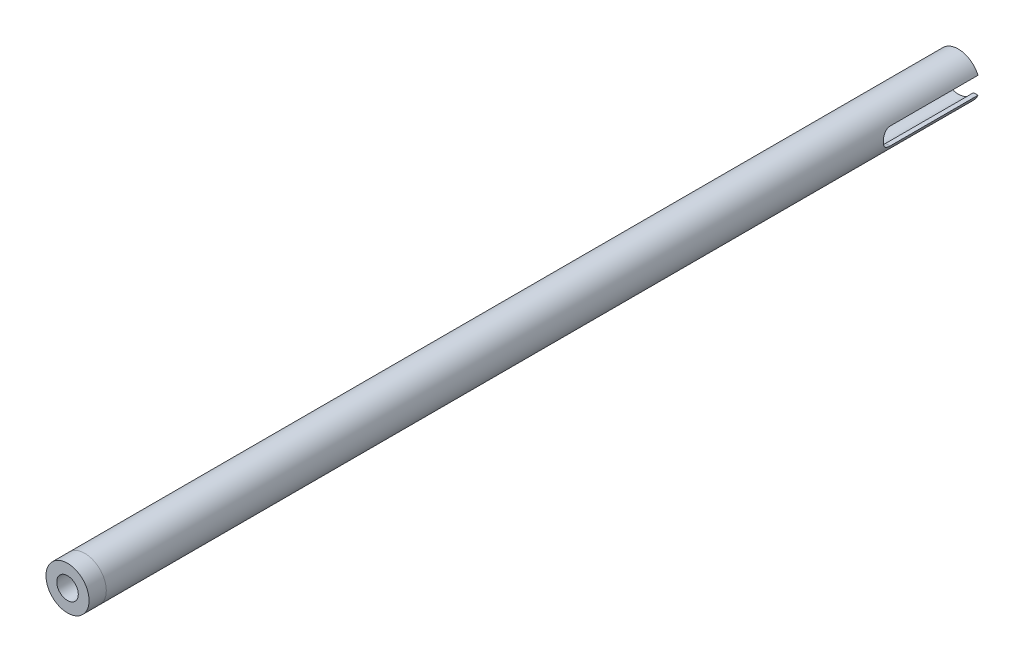
ISO-10303-21;
HEADER;
FILE_DESCRIPTION(('STEP AP214'),'2;1');
FILE_NAME('part.step','',(''),(''),'','','');
FILE_SCHEMA(('AUTOMOTIVE_DESIGN { 1 0 10303 214 1 1 1 1 }'));
ENDSEC;
DATA;
#1=APPLICATION_CONTEXT('core data for automotive mechanical design processes');
#2=APPLICATION_PROTOCOL_DEFINITION('international standard','automotive_design',2000,#1);
#3=PRODUCT_CONTEXT('',#1,'mechanical');
#4=PRODUCT('Part','Part','',(#3));
#5=PRODUCT_RELATED_PRODUCT_CATEGORY('part','',(#4));
#6=PRODUCT_DEFINITION_FORMATION('','',#4);
#7=PRODUCT_DEFINITION_CONTEXT('part definition',#1,'design');
#8=PRODUCT_DEFINITION('design','',#6,#7);
#9=PRODUCT_DEFINITION_SHAPE('','',#8);
#10=(LENGTH_UNIT() NAMED_UNIT(*) SI_UNIT(.MILLI.,.METRE.));
#11=(NAMED_UNIT(*) PLANE_ANGLE_UNIT() SI_UNIT($,.RADIAN.));
#12=(NAMED_UNIT(*) SI_UNIT($,.STERADIAN.) SOLID_ANGLE_UNIT());
#13=UNCERTAINTY_MEASURE_WITH_UNIT(LENGTH_MEASURE(1.E-05),#10,'distance_accuracy_value','');
#14=(GEOMETRIC_REPRESENTATION_CONTEXT(3) GLOBAL_UNCERTAINTY_ASSIGNED_CONTEXT((#13)) GLOBAL_UNIT_ASSIGNED_CONTEXT((#10,
#11,#12)) REPRESENTATION_CONTEXT('',''));
#15=CARTESIAN_POINT('',(0.,0.,0.));
#16=DIRECTION('',(0.,0.,1.));
#17=DIRECTION('',(1.,0.,0.));
#18=AXIS2_PLACEMENT_3D('',#15,#16,#17);
#19=CARTESIAN_POINT('',(0.,0.,-328.070249741066));
#20=DIRECTION('',(0.,0.,1.));
#21=DIRECTION('',(1.,0.,0.));
#22=AXIS2_PLACEMENT_3D('',#19,#20,#21);
#23=CYLINDRICAL_SURFACE('',#22,7.9375);
#24=CARTESIAN_POINT('',(0.,0.,-6.35));
#25=DIRECTION('',(0.,0.,1.));
#26=DIRECTION('',(1.,0.,0.));
#27=AXIS2_PLACEMENT_3D('',#24,#25,#26);
#28=CIRCLE('',#27,7.9375);
#29=CARTESIAN_POINT('',(7.9375,0.,-6.35));
#30=VERTEX_POINT('',#29);
#31=EDGE_CURVE('E167',#30,#30,#28,.T.);
#32=ORIENTED_EDGE('',*,*,#31,.F.);
#33=EDGE_LOOP('',(#32));
#34=FACE_BOUND('',#33,.T.);
#35=CARTESIAN_POINT('',(-7.2748389157424,3.175,-295.685249741066));
#36=CARTESIAN_POINT('',(-7.27482137043434,3.17501267173453,-295.599829625583));
#37=CARTESIAN_POINT('',(-7.27634297592672,3.17155313247793,-295.514419096021));
#38=CARTESIAN_POINT('',(-7.28233338484875,3.15778866907725,-295.344287091693));
#39=CARTESIAN_POINT('',(-7.28680106535325,3.14748635311323,-295.259565366834));
#40=CARTESIAN_POINT('',(-7.2985291631267,3.12019002880163,-295.091751667025));
#41=CARTESIAN_POINT('',(-7.30577831906487,3.10322299732752,-295.008654522266));
#42=CARTESIAN_POINT('',(-7.32282161153744,3.06278779397035,-294.84434342024));
#43=CARTESIAN_POINT('',(-7.33261590324725,3.03931922568674,-294.763129578127));
#44=CARTESIAN_POINT('',(-7.36535331460444,2.95952924342962,-294.523304755544));
#45=CARTESIAN_POINT('',(-7.39167595677839,2.89376893609239,-294.36817982674));
#46=CARTESIAN_POINT('',(-7.45033259991547,2.73920602658923,-294.071092400029));
#47=CARTESIAN_POINT('',(-7.48267254395243,2.65038060922872,-293.929143124811));
#48=CARTESIAN_POINT('',(-7.55175295441387,2.44684429809694,-293.654422355292));
#49=CARTESIAN_POINT('',(-7.58863404630155,2.33103943595687,-293.52249497078));
#50=CARTESIAN_POINT('',(-7.66147718953598,2.07914562663533,-293.279332087148));
#51=CARTESIAN_POINT('',(-7.69743902899202,1.94305205135846,-293.16810132222));
#52=CARTESIAN_POINT('',(-7.76611692840651,1.64778282664419,-292.965180122725));
#53=CARTESIAN_POINT('',(-7.79864638434712,1.48790317306356,-292.874445711321));
#54=CARTESIAN_POINT('',(-7.85502980346525,1.15369615984563,-292.721588157904));
#55=CARTESIAN_POINT('',(-7.87889360585224,0.979385463602722,-292.659432545286));
#56=CARTESIAN_POINT('',(-7.91022225039827,0.670405323433354,-292.57892090163));
#57=CARTESIAN_POINT('',(-7.92038443902171,0.537888188660439,-292.553242978221));
#58=CARTESIAN_POINT('',(-7.93061686811603,0.337231082382107,-292.527487895139));
#59=CARTESIAN_POINT('',(-7.93319257341971,0.269991647180298,-292.521029797859));
#60=CARTESIAN_POINT('',(-7.93663621925193,0.135173873369596,-292.512408780107));
#61=CARTESIAN_POINT('',(-7.93750363389236,0.0675954368175869,-292.510247182288));
#62=CARTESIAN_POINT('',(-7.9375,0.,-292.510249741066));
#63=B_SPLINE_CURVE_WITH_KNOTS('',3,(#35,#36,#37,#38,#39,#40,#41,#42,#43,#44,#45,#46,#47,#48,#49,
#50,#51,#52,#53,#54,#55,#56,#57,#58,#59,#60,#61,#62),.UNSPECIFIED.,.F.,.F.,(4,2,2,2,2,2,2,2,2,2,
2,2,2,4),(0.,0.256160797396612,0.512224013007058,0.767261264672238,1.02231406945471,
1.53142416248594,2.04103978047897,2.57679273649405,3.11266809162683,3.66991136029742,
4.22651992730645,4.63134321412666,4.8339937586662,5.03670667834028),.UNSPECIFIED.);
#64=CARTESIAN_POINT('',(-7.2748389157424,3.175,-295.685249741066));
#65=VERTEX_POINT('',#64);
#66=CARTESIAN_POINT('',(-7.9375,0.,-292.510249741066));
#67=VERTEX_POINT('',#66);
#68=EDGE_CURVE('E194',#65,#67,#63,.T.);
#69=ORIENTED_EDGE('',*,*,#68,.T.);
#70=CARTESIAN_POINT('',(-7.9375,0.,-292.510249741066));
#71=CARTESIAN_POINT('',(-7.93751279435796,-0.0856973243893185,-292.510237710897));
#72=CARTESIAN_POINT('',(-7.93611246860092,-0.171386675169291,-292.513719078369));
#73=CARTESIAN_POINT('',(-7.93058107051394,-0.342092796869088,-292.527575173703));
#74=CARTESIAN_POINT('',(-7.92645080745519,-0.427109759557717,-292.537947858687));
#75=CARTESIAN_POINT('',(-7.91557399086504,-0.595570690948319,-292.565445052754));
#76=CARTESIAN_POINT('',(-7.90883664469869,-0.67901912358001,-292.582545804027));
#77=CARTESIAN_POINT('',(-7.89293284658536,-0.844038966454646,-292.6233130515));
#78=CARTESIAN_POINT('',(-7.88376629739099,-0.925610301410303,-292.646979810557));
#79=CARTESIAN_POINT('',(-7.85297007832481,-1.16656173687588,-292.727487466256));
#80=CARTESIAN_POINT('',(-7.82802544143958,-1.32244720282989,-292.793880099133));
#81=CARTESIAN_POINT('',(-7.77174407779742,-1.62081902572888,-292.949925503126));
#82=CARTESIAN_POINT('',(-7.74040257287306,-1.7632952496653,-293.039595675189));
#83=CARTESIAN_POINT('',(-7.67287736621953,-2.03755465224644,-293.244049282704));
#84=CARTESIAN_POINT('',(-7.63654472176442,-2.16862853615059,-293.359736139436));
#85=CARTESIAN_POINT('',(-7.56380976030912,-2.41011022612819,-293.611030241145));
#86=CARTESIAN_POINT('',(-7.52740741976911,-2.52050895891189,-293.746646185627));
#87=CARTESIAN_POINT('',(-7.45683282624284,-2.72240939900242,-294.041344680493));
#88=CARTESIAN_POINT('',(-7.4228346735038,-2.81283701743189,-294.201208670409));
#89=CARTESIAN_POINT('',(-7.3633362219632,-2.96511894168388,-294.535334635205));
#90=CARTESIAN_POINT('',(-7.33782422493328,-3.02701262758154,-294.709576372964));
#91=CARTESIAN_POINT('',(-7.30424985403508,-3.10695047193342,-295.017880097616));
#92=CARTESIAN_POINT('',(-7.29331360019113,-3.13238569878909,-295.149738858502));
#93=CARTESIAN_POINT('',(-7.28227977674291,-3.15790858319001,-295.349455740196));
#94=CARTESIAN_POINT('',(-7.27949685702346,-3.16431127275807,-295.416404030955));
#95=CARTESIAN_POINT('',(-7.27577355567174,-3.17285909036155,-295.550645588822));
#96=CARTESIAN_POINT('',(-7.27483380475762,-3.1750027609968,-295.617938966119));
#97=CARTESIAN_POINT('',(-7.2748389157424,-3.175,-295.685249741066));
#98=B_SPLINE_CURVE_WITH_KNOTS('',3,(#70,#71,#72,#73,#74,#75,#76,#77,#78,#79,#80,#81,#82,#83,#84,
#85,#86,#87,#88,#89,#90,#91,#92,#93,#94,#95,#96,#97),.UNSPECIFIED.,.F.,.F.,(4,2,2,2,2,2,2,2,2,2,
2,2,2,4),(0.,0.256996432008007,0.513916713336978,0.769937797705386,1.02596913282157,
1.53722547809954,2.04886511530059,2.58219314099272,3.11575467201799,3.67332953074261,
4.2301325519037,4.63306130520181,4.83485003827446,5.03670780985612),.UNSPECIFIED.);
#99=CARTESIAN_POINT('',(-7.2748389157424,-3.175,-295.685249741066));
#100=VERTEX_POINT('',#99);
#101=EDGE_CURVE('E146',#67,#100,#98,.T.);
#102=ORIENTED_EDGE('',*,*,#101,.T.);
#103=DIRECTION('',(0.,0.,-1.));
#104=VECTOR('',#103,1.);
#105=CARTESIAN_POINT('',(-7.2748389157424,-3.175,-292.510249741066));
#106=LINE('',#105,#104);
#107=CARTESIAN_POINT('',(-7.2748389157424,-3.175,-328.070249741066));
#108=VERTEX_POINT('',#107);
#109=EDGE_CURVE('E141',#100,#108,#106,.T.);
#110=ORIENTED_EDGE('',*,*,#109,.T.);
#111=CARTESIAN_POINT('',(0.,0.,-328.070249741066));
#112=DIRECTION('',(0.,0.,1.));
#113=DIRECTION('',(1.,0.,0.));
#114=AXIS2_PLACEMENT_3D('',#111,#112,#113);
#115=CIRCLE('',#114,7.9375);
#116=CARTESIAN_POINT('',(7.2748389157424,-3.175,-328.070249741066));
#117=VERTEX_POINT('',#116);
#118=EDGE_CURVE('E144',#108,#117,#115,.T.);
#119=ORIENTED_EDGE('',*,*,#118,.T.);
#120=DIRECTION('',(0.,0.,-1.));
#121=VECTOR('',#120,1.);
#122=CARTESIAN_POINT('',(7.2748389157424,-3.175,-292.510249741066));
#123=LINE('',#122,#121);
#124=CARTESIAN_POINT('',(7.2748389157424,-3.175,-295.685249741066));
#125=VERTEX_POINT('',#124);
#126=EDGE_CURVE('E427',#125,#117,#123,.T.);
#127=ORIENTED_EDGE('',*,*,#126,.F.);
#128=CARTESIAN_POINT('',(7.2748389157424,-3.175,-295.685249741066));
#129=CARTESIAN_POINT('',(7.27482137043434,-3.17501267173453,-295.599829625583));
#130=CARTESIAN_POINT('',(7.27634297592672,-3.17155313247793,-295.514419096021));
#131=CARTESIAN_POINT('',(7.28233338484875,-3.15778866907725,-295.344287091693));
#132=CARTESIAN_POINT('',(7.28680106535325,-3.14748635311323,-295.259565366834));
#133=CARTESIAN_POINT('',(7.2985291631267,-3.12019002880163,-295.091751667025));
#134=CARTESIAN_POINT('',(7.30577831906487,-3.10322299732752,-295.008654522266));
#135=CARTESIAN_POINT('',(7.32282161153744,-3.06278779397035,-294.84434342024));
#136=CARTESIAN_POINT('',(7.33261590324725,-3.03931922568674,-294.763129578127));
#137=CARTESIAN_POINT('',(7.36535331460444,-2.95952924342962,-294.523304755544));
#138=CARTESIAN_POINT('',(7.39167595677839,-2.89376893609239,-294.36817982674));
#139=CARTESIAN_POINT('',(7.45033259991547,-2.73920602658923,-294.071092400029));
#140=CARTESIAN_POINT('',(7.48267254395243,-2.65038060922872,-293.929143124811));
#141=CARTESIAN_POINT('',(7.55175295441387,-2.44684429809694,-293.654422355292));
#142=CARTESIAN_POINT('',(7.58863404630155,-2.33103943595687,-293.52249497078));
#143=CARTESIAN_POINT('',(7.66147718953598,-2.07914562663533,-293.279332087148));
#144=CARTESIAN_POINT('',(7.69743902899202,-1.94305205135846,-293.16810132222));
#145=CARTESIAN_POINT('',(7.76611692840651,-1.64778282664419,-292.965180122725));
#146=CARTESIAN_POINT('',(7.79864638434712,-1.48790317306356,-292.874445711321));
#147=CARTESIAN_POINT('',(7.85502980346525,-1.15369615984563,-292.721588157904));
#148=CARTESIAN_POINT('',(7.87889360585224,-0.979385463602722,-292.659432545286));
#149=CARTESIAN_POINT('',(7.91022225039827,-0.670405323433354,-292.57892090163));
#150=CARTESIAN_POINT('',(7.92038443902171,-0.537888188660439,-292.553242978221));
#151=CARTESIAN_POINT('',(7.93061686811603,-0.337231082382107,-292.527487895139));
#152=CARTESIAN_POINT('',(7.93319257341971,-0.269991647180298,-292.521029797859));
#153=CARTESIAN_POINT('',(7.93663621925193,-0.135173873369596,-292.512408780107));
#154=CARTESIAN_POINT('',(7.93750363389236,-0.0675954368175869,-292.510247182288));
#155=CARTESIAN_POINT('',(7.9375,0.,-292.510249741066));
#156=B_SPLINE_CURVE_WITH_KNOTS('',3,(#128,#129,#130,#131,#132,#133,#134,#135,#136,#137,#138,
#139,#140,#141,#142,#143,#144,#145,#146,#147,#148,#149,#150,#151,#152,#153,#154,#155),
.UNSPECIFIED.,.F.,.F.,(4,2,2,2,2,2,2,2,2,2,2,2,2,4),(0.,0.256160797396612,0.512224013007058,
0.767261264672238,1.02231406945471,1.53142416248594,2.04103978047897,2.57679273649405,
3.11266809162683,3.66991136029742,4.22651992730645,4.63134321412666,4.8339937586662,
5.03670667834028),.UNSPECIFIED.);
#157=CARTESIAN_POINT('',(7.9375,0.,-292.510249741066));
#158=VERTEX_POINT('',#157);
#159=EDGE_CURVE('E87',#125,#158,#156,.T.);
#160=ORIENTED_EDGE('',*,*,#159,.T.);
#161=CARTESIAN_POINT('',(7.9375,0.,-292.510249741066));
#162=CARTESIAN_POINT('',(7.93751279435796,0.0856973243893185,-292.510237710897));
#163=CARTESIAN_POINT('',(7.93611246860092,0.171386675169291,-292.513719078369));
#164=CARTESIAN_POINT('',(7.93058107051394,0.342092796869088,-292.527575173703));
#165=CARTESIAN_POINT('',(7.92645080745519,0.427109759557717,-292.537947858687));
#166=CARTESIAN_POINT('',(7.91557399086504,0.595570690948319,-292.565445052754));
#167=CARTESIAN_POINT('',(7.90883664469869,0.67901912358001,-292.582545804027));
#168=CARTESIAN_POINT('',(7.89293284658536,0.844038966454646,-292.6233130515));
#169=CARTESIAN_POINT('',(7.88376629739099,0.925610301410303,-292.646979810557));
#170=CARTESIAN_POINT('',(7.85297007832481,1.16656173687588,-292.727487466256));
#171=CARTESIAN_POINT('',(7.82802544143958,1.32244720282989,-292.793880099133));
#172=CARTESIAN_POINT('',(7.77174407779742,1.62081902572888,-292.949925503126));
#173=CARTESIAN_POINT('',(7.74040257287306,1.7632952496653,-293.039595675189));
#174=CARTESIAN_POINT('',(7.67287736621953,2.03755465224644,-293.244049282704));
#175=CARTESIAN_POINT('',(7.63654472176442,2.16862853615059,-293.359736139436));
#176=CARTESIAN_POINT('',(7.56380976030912,2.41011022612819,-293.611030241145));
#177=CARTESIAN_POINT('',(7.52740741976911,2.52050895891189,-293.746646185627));
#178=CARTESIAN_POINT('',(7.45683282624284,2.72240939900242,-294.041344680493));
#179=CARTESIAN_POINT('',(7.4228346735038,2.81283701743189,-294.201208670409));
#180=CARTESIAN_POINT('',(7.3633362219632,2.96511894168388,-294.535334635205));
#181=CARTESIAN_POINT('',(7.33782422493328,3.02701262758154,-294.709576372964));
#182=CARTESIAN_POINT('',(7.30424985403508,3.10695047193342,-295.017880097616));
#183=CARTESIAN_POINT('',(7.29331360019113,3.13238569878909,-295.149738858502));
#184=CARTESIAN_POINT('',(7.28227977674291,3.15790858319001,-295.349455740196));
#185=CARTESIAN_POINT('',(7.27949685702346,3.16431127275807,-295.416404030955));
#186=CARTESIAN_POINT('',(7.27577355567174,3.17285909036155,-295.550645588822));
#187=CARTESIAN_POINT('',(7.27483380475762,3.1750027609968,-295.617938966119));
#188=CARTESIAN_POINT('',(7.2748389157424,3.175,-295.685249741066));
#189=B_SPLINE_CURVE_WITH_KNOTS('',3,(#161,#162,#163,#164,#165,#166,#167,#168,#169,#170,#171,
#172,#173,#174,#175,#176,#177,#178,#179,#180,#181,#182,#183,#184,#185,#186,#187,#188),
.UNSPECIFIED.,.F.,.F.,(4,2,2,2,2,2,2,2,2,2,2,2,2,4),(0.,0.256996432008007,0.513916713336978,
0.769937797705386,1.02596913282157,1.53722547809954,2.04886511530059,2.58219314099272,
3.11575467201799,3.67332953074261,4.2301325519037,4.63306130520181,4.83485003827446,
5.03670780985612),.UNSPECIFIED.);
#190=CARTESIAN_POINT('',(7.2748389157424,3.175,-295.685249741066));
#191=VERTEX_POINT('',#190);
#192=EDGE_CURVE('E73',#158,#191,#189,.T.);
#193=ORIENTED_EDGE('',*,*,#192,.T.);
#194=DIRECTION('',(0.,0.,-1.));
#195=VECTOR('',#194,1.);
#196=CARTESIAN_POINT('',(7.2748389157424,3.175,-292.510249741066));
#197=LINE('',#196,#195);
#198=CARTESIAN_POINT('',(7.2748389157424,3.175,-328.070249741066));
#199=VERTEX_POINT('',#198);
#200=EDGE_CURVE('E160',#191,#199,#197,.T.);
#201=ORIENTED_EDGE('',*,*,#200,.T.);
#202=CARTESIAN_POINT('',(-7.2748389157424,3.175,-328.070249741066));
#203=VERTEX_POINT('',#202);
#204=EDGE_CURVE('E166',#199,#203,#115,.T.);
#205=ORIENTED_EDGE('',*,*,#204,.T.);
#206=DIRECTION('',(0.,0.,-1.));
#207=VECTOR('',#206,1.);
#208=CARTESIAN_POINT('',(-7.2748389157424,3.175,-292.510249741066));
#209=LINE('',#208,#207);
#210=EDGE_CURVE('E420',#65,#203,#209,.T.);
#211=ORIENTED_EDGE('',*,*,#210,.F.);
#212=EDGE_LOOP('',(#69,#102,#110,#119,#127,#160,#193,#201,#205,#211));
#213=FACE_BOUND('',#212,.T.);
#214=ADVANCED_FACE('F63',(#34,#213),#23,.T.);
#215=CARTESIAN_POINT('',(0.,0.,-328.070249741066));
#216=DIRECTION('',(0.,0.,1.));
#217=DIRECTION('',(1.,0.,0.));
#218=AXIS2_PLACEMENT_3D('',#215,#216,#217);
#219=PLANE('',#218);
#220=DIRECTION('',(1.,0.,0.));
#221=VECTOR('',#220,1.);
#222=CARTESIAN_POINT('',(0.,-3.175,-328.070249741066));
#223=LINE('',#222,#221);
#224=CARTESIAN_POINT('',(-5.63085690548073,-3.175,-328.070249741066));
#225=VERTEX_POINT('',#224);
#226=EDGE_CURVE('E153',#108,#225,#223,.T.);
#227=ORIENTED_EDGE('',*,*,#226,.T.);
#228=CARTESIAN_POINT('',(0.,0.,-328.070249741066));
#229=DIRECTION('',(0.,0.,1.));
#230=DIRECTION('',(1.,0.,0.));
#231=AXIS2_PLACEMENT_3D('',#228,#229,#230);
#232=CIRCLE('',#231,6.4643);
#233=CARTESIAN_POINT('',(5.63085690548073,-3.175,-328.070249741066));
#234=VERTEX_POINT('',#233);
#235=EDGE_CURVE('E275',#225,#234,#232,.T.);
#236=ORIENTED_EDGE('',*,*,#235,.T.);
#237=DIRECTION('',(1.,0.,0.));
#238=VECTOR('',#237,1.);
#239=CARTESIAN_POINT('',(0.,-3.175,-328.070249741066));
#240=LINE('',#239,#238);
#241=EDGE_CURVE('E165',#234,#117,#240,.T.);
#242=ORIENTED_EDGE('',*,*,#241,.T.);
#243=ORIENTED_EDGE('',*,*,#118,.F.);
#244=EDGE_LOOP('',(#227,#236,#242,#243));
#245=FACE_BOUND('',#244,.T.);
#246=ADVANCED_FACE('F163',(#245),#219,.F.);
#247=CARTESIAN_POINT('',(0.,0.,-328.070249741066));
#248=DIRECTION('',(0.,0.,1.));
#249=DIRECTION('',(1.,0.,0.));
#250=AXIS2_PLACEMENT_3D('',#247,#248,#249);
#251=CYLINDRICAL_SURFACE('',#250,6.4643);
#252=CARTESIAN_POINT('',(0.,0.,-6.35));
#253=DIRECTION('',(0.,0.,1.));
#254=DIRECTION('',(1.,0.,0.));
#255=AXIS2_PLACEMENT_3D('',#252,#253,#254);
#256=CIRCLE('',#255,6.4643);
#257=CARTESIAN_POINT('',(6.4643,0.,-6.35));
#258=VERTEX_POINT('',#257);
#259=EDGE_CURVE('E149',#258,#258,#256,.T.);
#260=ORIENTED_EDGE('',*,*,#259,.T.);
#261=EDGE_LOOP('',(#260));
#262=FACE_BOUND('',#261,.T.);
#263=DIRECTION('',(0.,0.,-1.));
#264=VECTOR('',#263,1.);
#265=CARTESIAN_POINT('',(-5.63085690548073,-3.175,-292.510249741066));
#266=LINE('',#265,#264);
#267=CARTESIAN_POINT('',(-5.63085690548073,-3.175,-295.685249741066));
#268=VERTEX_POINT('',#267);
#269=EDGE_CURVE('E150',#268,#225,#266,.T.);
#270=ORIENTED_EDGE('',*,*,#269,.F.);
#271=CARTESIAN_POINT('',(-5.63085690548073,-3.175,-295.685249741066));
#272=CARTESIAN_POINT('',(-5.63083313994649,-3.17501475983035,-295.601872906345));
#273=CARTESIAN_POINT('',(-5.63270815771784,-3.17171623434453,-295.518509231176));
#274=CARTESIAN_POINT('',(-5.64007695954704,-3.15860868668088,-295.352504089081));
#275=CARTESIAN_POINT('',(-5.645568609108,-3.14880350463522,-295.269862225282));
#276=CARTESIAN_POINT('',(-5.65995160356269,-3.12287177657854,-295.106358960612));
#277=CARTESIAN_POINT('',(-5.66882360641349,-3.10678118209035,-295.025490148431));
#278=CARTESIAN_POINT('',(-5.68964253084949,-3.06848763641647,-294.865632768705));
#279=CARTESIAN_POINT('',(-5.70158978762268,-3.0462840189221,-294.786644407145));
#280=CARTESIAN_POINT('',(-5.74141867016874,-2.9709479042579,-294.553586161183));
#281=CARTESIAN_POINT('',(-5.77333273238342,-2.90901346570841,-294.40294962055));
#282=CARTESIAN_POINT('',(-5.84425759514897,-2.763754188191,-294.114094515715));
#283=CARTESIAN_POINT('',(-5.88327925344641,-2.68039654138926,-293.975895440652));
#284=CARTESIAN_POINT('',(-5.96775435279507,-2.48697819565355,-293.703954402413));
#285=CARTESIAN_POINT('',(-6.01347229172614,-2.37533204038057,-293.571419596064));
#286=CARTESIAN_POINT('',(-6.10404593063631,-2.13182339161096,-293.326044012986));
#287=CARTESIAN_POINT('',(-6.14890136897125,-1.99995486913048,-293.213209131007));
#288=CARTESIAN_POINT('',(-6.23619220514827,-1.70925564842441,-293.003225747087));
#289=CARTESIAN_POINT('',(-6.27828027392068,-1.54922894444793,-292.907575471358));
#290=CARTESIAN_POINT('',(-6.351789494002,-1.21302302470908,-292.745191566141));
#291=CARTESIAN_POINT('',(-6.3832266631188,-1.03686857473503,-292.678414472337));
#292=CARTESIAN_POINT('',(-6.42590822780063,-0.717171909263578,-292.588981825029));
#293=CARTESIAN_POINT('',(-6.4401838278065,-0.575906031157537,-292.559593580106));
#294=CARTESIAN_POINT('',(-6.45458743188517,-0.361448476439118,-292.530060860445));
#295=CARTESIAN_POINT('',(-6.45822048728408,-0.289432204318672,-292.522641415684));
#296=CARTESIAN_POINT('',(-6.46308007773031,-0.144952050292043,-292.512732943523));
#297=CARTESIAN_POINT('',(-6.46430565210199,-0.072488001271515,-292.510245884328));
#298=CARTESIAN_POINT('',(-6.4643,0.,-292.510249741066));
#299=B_SPLINE_CURVE_WITH_KNOTS('',3,(#271,#272,#273,#274,#275,#276,#277,#278,#279,#280,#281,
#282,#283,#284,#285,#286,#287,#288,#289,#290,#291,#292,#293,#294,#295,#296,#297,#298),
.UNSPECIFIED.,.F.,.F.,(4,2,2,2,2,2,2,2,2,2,2,2,2,4),(0.,0.250022608278555,0.499897788003946,
0.748364171658939,0.996857648438736,1.49241740389683,1.9887406369739,2.52413245916958,
3.05968421153491,3.63008006190818,4.19961425046545,4.63293550793411,4.85021333970384,
5.06757785591817),.UNSPECIFIED.);
#300=CARTESIAN_POINT('',(-6.4643,0.,-292.510249741066));
#301=VERTEX_POINT('',#300);
#302=EDGE_CURVE('E221',#268,#301,#299,.T.);
#303=ORIENTED_EDGE('',*,*,#302,.T.);
#304=CARTESIAN_POINT('',(-6.4643,0.,-292.510249741066));
#305=CARTESIAN_POINT('',(-6.46431471784482,0.0839947643435499,-292.510236396939));
#306=CARTESIAN_POINT('',(-6.46266329267846,0.167980128010398,-292.513582496308));
#307=CARTESIAN_POINT('',(-6.45613851930725,0.335267070847885,-292.526889949912));
#308=CARTESIAN_POINT('',(-6.45126643524264,0.418568905327645,-292.53684870862));
#309=CARTESIAN_POINT('',(-6.4384393661228,0.583520093709583,-292.563218751089));
#310=CARTESIAN_POINT('',(-6.43049830091841,0.665175181914776,-292.579600905337));
#311=CARTESIAN_POINT('',(-6.41174605062734,0.826621713408832,-292.61861844509));
#312=CARTESIAN_POINT('',(-6.40093469346325,0.906413044651103,-292.641254205511));
#313=CARTESIAN_POINT('',(-6.3645999533627,1.14200454475575,-292.718153769603));
#314=CARTESIAN_POINT('',(-6.33514826225986,1.29435730209625,-292.781464402786));
#315=CARTESIAN_POINT('',(-6.26847721301058,1.5861501237047,-292.929955902616));
#316=CARTESIAN_POINT('',(-6.23125016174678,1.7255772002446,-293.015158448982));
#317=CARTESIAN_POINT('',(-6.14993667819984,1.99664965861334,-293.210672395111));
#318=CARTESIAN_POINT('',(-6.10557667432165,2.12736555519216,-293.322159254761));
#319=CARTESIAN_POINT('',(-6.01591119010694,2.36910305567937,-293.564561677944));
#320=CARTESIAN_POINT('',(-5.97060501254448,2.48010951928959,-293.69549203693));
#321=CARTESIAN_POINT('',(-5.88028635793905,2.68759195973765,-293.984814375672));
#322=CARTESIAN_POINT('',(-5.83554983812279,2.78235777578918,-294.144528478326));
#323=CARTESIAN_POINT('',(-5.75613746809778,2.94315382396594,-294.479879722902));
#324=CARTESIAN_POINT('',(-5.72144095718824,3.00924320962384,-294.655483174756));
#325=CARTESIAN_POINT('',(-5.67404956693615,3.09744900867387,-294.973487476442));
#326=CARTESIAN_POINT('',(-5.65804978215016,3.12636521602239,-295.113512166384));
#327=CARTESIAN_POINT('',(-5.64184153899281,3.1554574998571,-295.326260464994));
#328=CARTESIAN_POINT('',(-5.63773701667688,3.16277482388528,-295.397770353099));
#329=CARTESIAN_POINT('',(-5.63223913004552,3.17254960488947,-295.54126141487));
#330=CARTESIAN_POINT('',(-5.6308471601211,3.17500456237039,-295.613242811851));
#331=CARTESIAN_POINT('',(-5.63085690548073,3.175,-295.685249741066));
#332=B_SPLINE_CURVE_WITH_KNOTS('',3,(#304,#305,#306,#307,#308,#309,#310,#311,#312,#313,#314,
#315,#316,#317,#318,#319,#320,#321,#322,#323,#324,#325,#326,#327,#328,#329,#330,#331),
.UNSPECIFIED.,.F.,.F.,(4,2,2,2,2,2,2,2,2,2,2,2,2,4),(0.,0.251885801688016,0.503672794384369,
0.754330922106977,1.00500408047846,1.50534146760879,2.00617626510683,2.53624961383844,
3.06672840649523,3.63692439554962,4.20593853113138,4.63586569132644,4.85167139809474,
5.06758801082739),.UNSPECIFIED.);
#333=CARTESIAN_POINT('',(-5.63085690548073,3.175,-295.685249741066));
#334=VERTEX_POINT('',#333);
#335=EDGE_CURVE('E186',#301,#334,#332,.T.);
#336=ORIENTED_EDGE('',*,*,#335,.T.);
#337=DIRECTION('',(0.,0.,-1.));
#338=VECTOR('',#337,1.);
#339=CARTESIAN_POINT('',(-5.63085690548073,3.175,-292.510249741066));
#340=LINE('',#339,#338);
#341=CARTESIAN_POINT('',(-5.63085690548073,3.175,-328.070249741066));
#342=VERTEX_POINT('',#341);
#343=EDGE_CURVE('E417',#334,#342,#340,.T.);
#344=ORIENTED_EDGE('',*,*,#343,.T.);
#345=CARTESIAN_POINT('',(5.63085690548073,3.175,-328.070249741066));
#346=VERTEX_POINT('',#345);
#347=EDGE_CURVE('E172',#346,#342,#232,.T.);
#348=ORIENTED_EDGE('',*,*,#347,.F.);
#349=DIRECTION('',(0.,0.,-1.));
#350=VECTOR('',#349,1.);
#351=CARTESIAN_POINT('',(5.63085690548073,3.175,-292.510249741066));
#352=LINE('',#351,#350);
#353=CARTESIAN_POINT('',(5.63085690548073,3.175,-295.685249741066));
#354=VERTEX_POINT('',#353);
#355=EDGE_CURVE('E269',#354,#346,#352,.T.);
#356=ORIENTED_EDGE('',*,*,#355,.F.);
#357=CARTESIAN_POINT('',(5.63085690548073,3.175,-295.685249741066));
#358=CARTESIAN_POINT('',(5.63083313994649,3.17501475983035,-295.601872906345));
#359=CARTESIAN_POINT('',(5.63270815771784,3.17171623434453,-295.518509231176));
#360=CARTESIAN_POINT('',(5.64007695954704,3.15860868668088,-295.352504089081));
#361=CARTESIAN_POINT('',(5.645568609108,3.14880350463522,-295.269862225282));
#362=CARTESIAN_POINT('',(5.65995160356269,3.12287177657854,-295.106358960612));
#363=CARTESIAN_POINT('',(5.66882360641349,3.10678118209035,-295.025490148431));
#364=CARTESIAN_POINT('',(5.68964253084949,3.06848763641647,-294.865632768705));
#365=CARTESIAN_POINT('',(5.70158978762268,3.0462840189221,-294.786644407145));
#366=CARTESIAN_POINT('',(5.74141867016874,2.9709479042579,-294.553586161183));
#367=CARTESIAN_POINT('',(5.77333273238342,2.90901346570841,-294.40294962055));
#368=CARTESIAN_POINT('',(5.84425759514897,2.763754188191,-294.114094515715));
#369=CARTESIAN_POINT('',(5.88327925344641,2.68039654138926,-293.975895440652));
#370=CARTESIAN_POINT('',(5.96775435279507,2.48697819565355,-293.703954402413));
#371=CARTESIAN_POINT('',(6.01347229172614,2.37533204038057,-293.571419596064));
#372=CARTESIAN_POINT('',(6.10404593063631,2.13182339161096,-293.326044012986));
#373=CARTESIAN_POINT('',(6.14890136897125,1.99995486913048,-293.213209131007));
#374=CARTESIAN_POINT('',(6.23619220514827,1.70925564842441,-293.003225747087));
#375=CARTESIAN_POINT('',(6.27828027392068,1.54922894444793,-292.907575471358));
#376=CARTESIAN_POINT('',(6.351789494002,1.21302302470908,-292.745191566141));
#377=CARTESIAN_POINT('',(6.3832266631188,1.03686857473503,-292.678414472337));
#378=CARTESIAN_POINT('',(6.42590822780063,0.717171909263578,-292.588981825029));
#379=CARTESIAN_POINT('',(6.4401838278065,0.575906031157537,-292.559593580106));
#380=CARTESIAN_POINT('',(6.45458743188517,0.361448476439118,-292.530060860445));
#381=CARTESIAN_POINT('',(6.45822048728408,0.289432204318672,-292.522641415684));
#382=CARTESIAN_POINT('',(6.46308007773031,0.144952050292043,-292.512732943523));
#383=CARTESIAN_POINT('',(6.46430565210199,0.072488001271515,-292.510245884328));
#384=CARTESIAN_POINT('',(6.4643,0.,-292.510249741066));
#385=B_SPLINE_CURVE_WITH_KNOTS('',3,(#357,#358,#359,#360,#361,#362,#363,#364,#365,#366,#367,
#368,#369,#370,#371,#372,#373,#374,#375,#376,#377,#378,#379,#380,#381,#382,#383,#384),
.UNSPECIFIED.,.F.,.F.,(4,2,2,2,2,2,2,2,2,2,2,2,2,4),(0.,0.250022608278555,0.499897788003946,
0.748364171658939,0.996857648438736,1.49241740389683,1.9887406369739,2.52413245916958,
3.05968421153491,3.63008006190818,4.19961425046545,4.63293550793411,4.85021333970384,
5.06757785591817),.UNSPECIFIED.);
#386=CARTESIAN_POINT('',(6.4643,0.,-292.510249741066));
#387=VERTEX_POINT('',#386);
#388=EDGE_CURVE('E13',#354,#387,#385,.T.);
#389=ORIENTED_EDGE('',*,*,#388,.T.);
#390=CARTESIAN_POINT('',(6.4643,0.,-292.510249741066));
#391=CARTESIAN_POINT('',(6.46431471784482,-0.0839947643435499,-292.510236396939));
#392=CARTESIAN_POINT('',(6.46266329267846,-0.167980128010398,-292.513582496308));
#393=CARTESIAN_POINT('',(6.45613851930725,-0.335267070847885,-292.526889949912));
#394=CARTESIAN_POINT('',(6.45126643524264,-0.418568905327645,-292.53684870862));
#395=CARTESIAN_POINT('',(6.4384393661228,-0.583520093709583,-292.563218751089));
#396=CARTESIAN_POINT('',(6.43049830091841,-0.665175181914776,-292.579600905337));
#397=CARTESIAN_POINT('',(6.41174605062734,-0.826621713408832,-292.61861844509));
#398=CARTESIAN_POINT('',(6.40093469346325,-0.906413044651103,-292.641254205511));
#399=CARTESIAN_POINT('',(6.3645999533627,-1.14200454475575,-292.718153769603));
#400=CARTESIAN_POINT('',(6.33514826225986,-1.29435730209625,-292.781464402786));
#401=CARTESIAN_POINT('',(6.26847721301058,-1.5861501237047,-292.929955902616));
#402=CARTESIAN_POINT('',(6.23125016174678,-1.7255772002446,-293.015158448982));
#403=CARTESIAN_POINT('',(6.14993667819984,-1.99664965861334,-293.210672395111));
#404=CARTESIAN_POINT('',(6.10557667432165,-2.12736555519216,-293.322159254761));
#405=CARTESIAN_POINT('',(6.01591119010694,-2.36910305567937,-293.564561677944));
#406=CARTESIAN_POINT('',(5.97060501254448,-2.48010951928959,-293.69549203693));
#407=CARTESIAN_POINT('',(5.88028635793905,-2.68759195973765,-293.984814375672));
#408=CARTESIAN_POINT('',(5.83554983812279,-2.78235777578918,-294.144528478326));
#409=CARTESIAN_POINT('',(5.75613746809778,-2.94315382396594,-294.479879722902));
#410=CARTESIAN_POINT('',(5.72144095718824,-3.00924320962384,-294.655483174756));
#411=CARTESIAN_POINT('',(5.67404956693615,-3.09744900867387,-294.973487476442));
#412=CARTESIAN_POINT('',(5.65804978215016,-3.12636521602239,-295.113512166384));
#413=CARTESIAN_POINT('',(5.64184153899281,-3.1554574998571,-295.326260464994));
#414=CARTESIAN_POINT('',(5.63773701667688,-3.16277482388528,-295.397770353099));
#415=CARTESIAN_POINT('',(5.63223913004552,-3.17254960488947,-295.54126141487));
#416=CARTESIAN_POINT('',(5.6308471601211,-3.17500456237039,-295.613242811851));
#417=CARTESIAN_POINT('',(5.63085690548073,-3.175,-295.685249741066));
#418=B_SPLINE_CURVE_WITH_KNOTS('',3,(#390,#391,#392,#393,#394,#395,#396,#397,#398,#399,#400,
#401,#402,#403,#404,#405,#406,#407,#408,#409,#410,#411,#412,#413,#414,#415,#416,#417),
.UNSPECIFIED.,.F.,.F.,(4,2,2,2,2,2,2,2,2,2,2,2,2,4),(0.,0.251885801688016,0.503672794384369,
0.754330922106977,1.00500408047846,1.50534146760879,2.00617626510683,2.53624961383844,
3.06672840649523,3.63692439554962,4.20593853113138,4.63586569132644,4.85167139809474,
5.06758801082739),.UNSPECIFIED.);
#419=CARTESIAN_POINT('',(5.63085690548073,-3.175,-295.685249741066));
#420=VERTEX_POINT('',#419);
#421=EDGE_CURVE('E237',#387,#420,#418,.T.);
#422=ORIENTED_EDGE('',*,*,#421,.T.);
#423=DIRECTION('',(0.,0.,-1.));
#424=VECTOR('',#423,1.);
#425=CARTESIAN_POINT('',(5.63085690548073,-3.175,-292.510249741066));
#426=LINE('',#425,#424);
#427=EDGE_CURVE('E271',#420,#234,#426,.T.);
#428=ORIENTED_EDGE('',*,*,#427,.T.);
#429=ORIENTED_EDGE('',*,*,#235,.F.);
#430=EDGE_LOOP('',(#270,#303,#336,#344,#348,#356,#389,#422,#428,#429));
#431=FACE_BOUND('',#430,.T.);
#432=ADVANCED_FACE('F201',(#262,#431),#251,.F.);
#433=ORIENTED_EDGE('',*,*,#347,.T.);
#434=DIRECTION('',(1.,0.,0.));
#435=VECTOR('',#434,1.);
#436=CARTESIAN_POINT('',(0.,3.175,-328.070249741066));
#437=LINE('',#436,#435);
#438=EDGE_CURVE('E159',#203,#342,#437,.T.);
#439=ORIENTED_EDGE('',*,*,#438,.F.);
#440=ORIENTED_EDGE('',*,*,#204,.F.);
#441=DIRECTION('',(1.,0.,0.));
#442=VECTOR('',#441,1.);
#443=CARTESIAN_POINT('',(0.,3.175,-328.070249741066));
#444=LINE('',#443,#442);
#445=EDGE_CURVE('E253',#346,#199,#444,.T.);
#446=ORIENTED_EDGE('',*,*,#445,.F.);
#447=EDGE_LOOP('',(#433,#439,#440,#446));
#448=FACE_BOUND('',#447,.T.);
#449=ADVANCED_FACE('F286',(#448),#219,.F.);
#450=CARTESIAN_POINT('',(0.,0.,-6.35));
#451=DIRECTION('',(0.,0.,1.));
#452=DIRECTION('',(1.,0.,0.));
#453=AXIS2_PLACEMENT_3D('',#450,#451,#452);
#454=PLANE('',#453);
#455=ORIENTED_EDGE('',*,*,#259,.F.);
#456=EDGE_LOOP('',(#455));
#457=FACE_BOUND('',#456,.T.);
#458=ORIENTED_EDGE('',*,*,#31,.T.);
#459=EDGE_LOOP('',(#458));
#460=FACE_BOUND('',#459,.T.);
#461=ADVANCED_FACE('F283',(#457,#460),#454,.T.);
#462=CARTESIAN_POINT('',(0.,3.175,-292.510249741066));
#463=DIRECTION('',(0.,1.,0.));
#464=DIRECTION('',(0.,0.,1.));
#465=AXIS2_PLACEMENT_3D('',#462,#463,#464);
#466=PLANE('',#465);
#467=ORIENTED_EDGE('',*,*,#200,.F.);
#468=DIRECTION('',(1.,0.,0.));
#469=VECTOR('',#468,1.);
#470=CARTESIAN_POINT('',(5.63085690548073,3.175,-295.685249741066));
#471=LINE('',#470,#469);
#472=EDGE_CURVE('E184',#191,#354,#471,.F.);
#473=ORIENTED_EDGE('',*,*,#472,.T.);
#474=ORIENTED_EDGE('',*,*,#355,.T.);
#475=ORIENTED_EDGE('',*,*,#445,.T.);
#476=EDGE_LOOP('',(#467,#473,#474,#475));
#477=FACE_BOUND('',#476,.T.);
#478=ADVANCED_FACE('F266',(#477),#466,.F.);
#479=CARTESIAN_POINT('',(0.,-3.175,-292.510249741066));
#480=DIRECTION('',(0.,1.,0.));
#481=DIRECTION('',(0.,0.,1.));
#482=AXIS2_PLACEMENT_3D('',#479,#480,#481);
#483=PLANE('',#482);
#484=ORIENTED_EDGE('',*,*,#427,.F.);
#485=DIRECTION('',(1.,0.,0.));
#486=VECTOR('',#485,1.);
#487=CARTESIAN_POINT('',(0.,-3.175,-295.685249741066));
#488=LINE('',#487,#486);
#489=EDGE_CURVE('E181',#420,#125,#488,.T.);
#490=ORIENTED_EDGE('',*,*,#489,.T.);
#491=ORIENTED_EDGE('',*,*,#126,.T.);
#492=ORIENTED_EDGE('',*,*,#241,.F.);
#493=EDGE_LOOP('',(#484,#490,#491,#492));
#494=FACE_BOUND('',#493,.T.);
#495=ADVANCED_FACE('F361',(#494),#483,.T.);
#496=CARTESIAN_POINT('',(0.,-3.175,-292.510249741066));
#497=DIRECTION('',(0.,1.,0.));
#498=DIRECTION('',(0.,0.,1.));
#499=AXIS2_PLACEMENT_3D('',#496,#497,#498);
#500=PLANE('',#499);
#501=ORIENTED_EDGE('',*,*,#109,.F.);
#502=DIRECTION('',(1.,0.,0.));
#503=VECTOR('',#502,1.);
#504=CARTESIAN_POINT('',(0.,-3.175,-295.685249741066));
#505=LINE('',#504,#503);
#506=EDGE_CURVE('E179',#100,#268,#505,.T.);
#507=ORIENTED_EDGE('',*,*,#506,.T.);
#508=ORIENTED_EDGE('',*,*,#269,.T.);
#509=ORIENTED_EDGE('',*,*,#226,.F.);
#510=EDGE_LOOP('',(#501,#507,#508,#509));
#511=FACE_BOUND('',#510,.T.);
#512=ADVANCED_FACE('F154',(#511),#500,.T.);
#513=CARTESIAN_POINT('',(0.,3.175,-292.510249741066));
#514=DIRECTION('',(0.,1.,0.));
#515=DIRECTION('',(0.,0.,1.));
#516=AXIS2_PLACEMENT_3D('',#513,#514,#515);
#517=PLANE('',#516);
#518=ORIENTED_EDGE('',*,*,#343,.F.);
#519=DIRECTION('',(1.,0.,0.));
#520=VECTOR('',#519,1.);
#521=CARTESIAN_POINT('',(-7.2748389157424,3.175,-295.685249741066));
#522=LINE('',#521,#520);
#523=EDGE_CURVE('E170',#334,#65,#522,.F.);
#524=ORIENTED_EDGE('',*,*,#523,.T.);
#525=ORIENTED_EDGE('',*,*,#210,.T.);
#526=ORIENTED_EDGE('',*,*,#438,.T.);
#527=EDGE_LOOP('',(#518,#524,#525,#526));
#528=FACE_BOUND('',#527,.T.);
#529=ADVANCED_FACE('F216',(#528),#517,.F.);
#530=CARTESIAN_POINT('',(0.,0.,-295.685249741066));
#531=DIRECTION('',(1.,0.,0.));
#532=DIRECTION('',(0.,0.,-1.));
#533=AXIS2_PLACEMENT_3D('',#530,#531,#532);
#534=CYLINDRICAL_SURFACE('',#533,3.175);
#535=ORIENTED_EDGE('',*,*,#506,.F.);
#536=ORIENTED_EDGE('',*,*,#101,.F.);
#537=DIRECTION('',(1.,0.,0.));
#538=VECTOR('',#537,1.);
#539=CARTESIAN_POINT('',(0.,0.,-292.510249741066));
#540=LINE('',#539,#538);
#541=EDGE_CURVE('E251',#301,#67,#540,.F.);
#542=ORIENTED_EDGE('',*,*,#541,.F.);
#543=ORIENTED_EDGE('',*,*,#302,.F.);
#544=EDGE_LOOP('',(#535,#536,#542,#543));
#545=FACE_BOUND('',#544,.T.);
#546=ADVANCED_FACE('F209',(#545),#534,.F.);
#547=CARTESIAN_POINT('',(0.,0.,-295.685249741066));
#548=DIRECTION('',(-1.,0.,0.));
#549=DIRECTION('',(0.,0.,1.));
#550=AXIS2_PLACEMENT_3D('',#547,#548,#549);
#551=CYLINDRICAL_SURFACE('',#550,3.175);
#552=ORIENTED_EDGE('',*,*,#68,.F.);
#553=ORIENTED_EDGE('',*,*,#523,.F.);
#554=ORIENTED_EDGE('',*,*,#335,.F.);
#555=ORIENTED_EDGE('',*,*,#541,.T.);
#556=EDGE_LOOP('',(#552,#553,#554,#555));
#557=FACE_BOUND('',#556,.T.);
#558=ADVANCED_FACE('F205',(#557),#551,.F.);
#559=CARTESIAN_POINT('',(0.,0.,-295.685249741066));
#560=DIRECTION('',(-1.,0.,0.));
#561=DIRECTION('',(0.,0.,1.));
#562=AXIS2_PLACEMENT_3D('',#559,#560,#561);
#563=CYLINDRICAL_SURFACE('',#562,3.175);
#564=DIRECTION('',(1.,0.,0.));
#565=VECTOR('',#564,1.);
#566=CARTESIAN_POINT('',(7.2748389157424,0.,-292.510249741066));
#567=LINE('',#566,#565);
#568=EDGE_CURVE('E68',#387,#158,#567,.T.);
#569=ORIENTED_EDGE('',*,*,#568,.F.);
#570=ORIENTED_EDGE('',*,*,#388,.F.);
#571=ORIENTED_EDGE('',*,*,#472,.F.);
#572=ORIENTED_EDGE('',*,*,#192,.F.);
#573=EDGE_LOOP('',(#569,#570,#571,#572));
#574=FACE_BOUND('',#573,.T.);
#575=ADVANCED_FACE('F65',(#574),#563,.F.);
#576=CARTESIAN_POINT('',(0.,0.,-295.685249741066));
#577=DIRECTION('',(1.,0.,0.));
#578=DIRECTION('',(0.,0.,-1.));
#579=AXIS2_PLACEMENT_3D('',#576,#577,#578);
#580=CYLINDRICAL_SURFACE('',#579,3.175);
#581=ORIENTED_EDGE('',*,*,#421,.F.);
#582=ORIENTED_EDGE('',*,*,#568,.T.);
#583=ORIENTED_EDGE('',*,*,#159,.F.);
#584=ORIENTED_EDGE('',*,*,#489,.F.);
#585=EDGE_LOOP('',(#581,#582,#583,#584));
#586=FACE_BOUND('',#585,.T.);
#587=ADVANCED_FACE('F218',(#586),#580,.F.);
#588=CLOSED_SHELL('',(#214,#246,#432,#449,#461,#478,#495,#512,#529,#546,#558,#575,#587));
#589=MANIFOLD_SOLID_BREP('B2',#588);
#590=CARTESIAN_POINT('',(0.,0.,-6.35));
#591=DIRECTION('',(0.,0.,1.));
#592=DIRECTION('',(1.,0.,0.));
#593=AXIS2_PLACEMENT_3D('',#590,#591,#592);
#594=CYLINDRICAL_SURFACE('',#593,7.9375);
#595=CARTESIAN_POINT('',(0.,0.,-6.35));
#596=DIRECTION('',(0.,0.,1.));
#597=DIRECTION('',(1.,0.,0.));
#598=AXIS2_PLACEMENT_3D('',#595,#596,#597);
#599=CIRCLE('',#598,7.9375);
#600=CARTESIAN_POINT('',(7.9375,0.,-6.35));
#601=VERTEX_POINT('',#600);
#602=EDGE_CURVE('E62',#601,#601,#599,.T.);
#603=ORIENTED_EDGE('',*,*,#602,.T.);
#604=EDGE_LOOP('',(#603));
#605=FACE_BOUND('',#604,.T.);
#606=CARTESIAN_POINT('',(0.,0.,0.));
#607=DIRECTION('',(0.,0.,1.));
#608=DIRECTION('',(1.,0.,0.));
#609=AXIS2_PLACEMENT_3D('',#606,#607,#608);
#610=CIRCLE('',#609,7.9375);
#611=CARTESIAN_POINT('',(7.9375,0.,0.));
#612=VERTEX_POINT('',#611);
#613=EDGE_CURVE('E465',#612,#612,#610,.T.);
#614=ORIENTED_EDGE('',*,*,#613,.F.);
#615=EDGE_LOOP('',(#614));
#616=FACE_BOUND('',#615,.T.);
#617=ADVANCED_FACE('F454',(#605,#616),#594,.T.);
#618=CARTESIAN_POINT('',(0.,0.,-6.35));
#619=DIRECTION('',(0.,0.,1.));
#620=DIRECTION('',(1.,0.,0.));
#621=AXIS2_PLACEMENT_3D('',#618,#619,#620);
#622=CYLINDRICAL_SURFACE('',#621,3.96875);
#623=CARTESIAN_POINT('',(0.,0.,0.));
#624=DIRECTION('',(0.,0.,1.));
#625=DIRECTION('',(1.,0.,0.));
#626=AXIS2_PLACEMENT_3D('',#623,#624,#625);
#627=CIRCLE('',#626,3.96875);
#628=CARTESIAN_POINT('',(3.96875,0.,0.));
#629=VERTEX_POINT('',#628);
#630=EDGE_CURVE('E457',#629,#629,#627,.T.);
#631=ORIENTED_EDGE('',*,*,#630,.T.);
#632=EDGE_LOOP('',(#631));
#633=FACE_BOUND('',#632,.T.);
#634=CARTESIAN_POINT('',(0.,0.,-15.875));
#635=DIRECTION('',(0.,0.,1.));
#636=DIRECTION('',(1.,0.,0.));
#637=AXIS2_PLACEMENT_3D('',#634,#635,#636);
#638=CIRCLE('',#637,3.96875);
#639=CARTESIAN_POINT('',(3.96875,0.,-15.875));
#640=VERTEX_POINT('',#639);
#641=EDGE_CURVE('E477',#640,#640,#638,.T.);
#642=ORIENTED_EDGE('',*,*,#641,.F.);
#643=EDGE_LOOP('',(#642));
#644=FACE_BOUND('',#643,.T.);
#645=ADVANCED_FACE('F485',(#633,#644),#622,.F.);
#646=CARTESIAN_POINT('',(0.,0.,-6.35));
#647=DIRECTION('',(0.,0.,1.));
#648=DIRECTION('',(1.,0.,0.));
#649=AXIS2_PLACEMENT_3D('',#646,#647,#648);
#650=PLANE('',#649);
#651=CARTESIAN_POINT('',(0.,0.,-6.35));
#652=DIRECTION('',(0.,0.,1.));
#653=DIRECTION('',(1.,0.,0.));
#654=AXIS2_PLACEMENT_3D('',#651,#652,#653);
#655=CIRCLE('',#654,6.4643);
#656=CARTESIAN_POINT('',(6.4643,0.,-6.35));
#657=VERTEX_POINT('',#656);
#658=EDGE_CURVE('E467',#657,#657,#655,.T.);
#659=ORIENTED_EDGE('',*,*,#658,.T.);
#660=EDGE_LOOP('',(#659));
#661=FACE_BOUND('',#660,.T.);
#662=ORIENTED_EDGE('',*,*,#602,.F.);
#663=EDGE_LOOP('',(#662));
#664=FACE_BOUND('',#663,.T.);
#665=ADVANCED_FACE('F487',(#661,#664),#650,.F.);
#666=CARTESIAN_POINT('',(0.,0.,0.));
#667=DIRECTION('',(0.,0.,1.));
#668=DIRECTION('',(1.,0.,0.));
#669=AXIS2_PLACEMENT_3D('',#666,#667,#668);
#670=PLANE('',#669);
#671=ORIENTED_EDGE('',*,*,#613,.T.);
#672=EDGE_LOOP('',(#671));
#673=FACE_BOUND('',#672,.T.);
#674=ORIENTED_EDGE('',*,*,#630,.F.);
#675=EDGE_LOOP('',(#674));
#676=FACE_BOUND('',#675,.T.);
#677=ADVANCED_FACE('F493',(#673,#676),#670,.T.);
#678=CARTESIAN_POINT('',(0.,0.,-15.875));
#679=DIRECTION('',(0.,0.,1.));
#680=DIRECTION('',(1.,0.,0.));
#681=AXIS2_PLACEMENT_3D('',#678,#679,#680);
#682=CYLINDRICAL_SURFACE('',#681,6.4643);
#683=CARTESIAN_POINT('',(0.,0.,-15.875));
#684=DIRECTION('',(0.,0.,1.));
#685=DIRECTION('',(1.,0.,0.));
#686=AXIS2_PLACEMENT_3D('',#683,#684,#685);
#687=CIRCLE('',#686,6.4643);
#688=CARTESIAN_POINT('',(6.4643,0.,-15.875));
#689=VERTEX_POINT('',#688);
#690=EDGE_CURVE('E470',#689,#689,#687,.T.);
#691=CARTESIAN_POINT('',(6.4643,0.,-15.875));
#692=CARTESIAN_POINT('',(6.4643,0.,-15.77578125));
#693=CARTESIAN_POINT('',(6.4643,0.,-15.6765625));
#694=CARTESIAN_POINT('',(6.4643,0.,-15.478125));
#695=CARTESIAN_POINT('',(6.4643,0.,-15.37890625));
#696=CARTESIAN_POINT('',(6.4643,0.,-15.18046875));
#697=CARTESIAN_POINT('',(6.4643,0.,-15.08125));
#698=CARTESIAN_POINT('',(6.4643,0.,-14.8828125));
#699=CARTESIAN_POINT('',(6.4643,0.,-14.78359375));
#700=CARTESIAN_POINT('',(6.4643,0.,-14.58515625));
#701=CARTESIAN_POINT('',(6.4643,0.,-14.4859375));
#702=CARTESIAN_POINT('',(6.4643,0.,-14.2875));
#703=CARTESIAN_POINT('',(6.4643,0.,-14.18828125));
#704=CARTESIAN_POINT('',(6.4643,0.,-13.98984375));
#705=CARTESIAN_POINT('',(6.4643,0.,-13.890625));
#706=CARTESIAN_POINT('',(6.4643,0.,-13.6921875));
#707=CARTESIAN_POINT('',(6.4643,0.,-13.59296875));
#708=CARTESIAN_POINT('',(6.4643,0.,-13.39453125));
#709=CARTESIAN_POINT('',(6.4643,0.,-13.2953125));
#710=CARTESIAN_POINT('',(6.4643,0.,-13.096875));
#711=CARTESIAN_POINT('',(6.4643,0.,-12.99765625));
#712=CARTESIAN_POINT('',(6.4643,0.,-12.79921875));
#713=CARTESIAN_POINT('',(6.4643,0.,-12.7));
#714=CARTESIAN_POINT('',(6.4643,0.,-12.5015625));
#715=CARTESIAN_POINT('',(6.4643,0.,-12.40234375));
#716=CARTESIAN_POINT('',(6.4643,0.,-12.20390625));
#717=CARTESIAN_POINT('',(6.4643,0.,-12.1046875));
#718=CARTESIAN_POINT('',(6.4643,0.,-11.90625));
#719=CARTESIAN_POINT('',(6.4643,0.,-11.80703125));
#720=CARTESIAN_POINT('',(6.4643,0.,-11.60859375));
#721=CARTESIAN_POINT('',(6.4643,0.,-11.509375));
#722=CARTESIAN_POINT('',(6.4643,0.,-11.3109375));
#723=CARTESIAN_POINT('',(6.4643,0.,-11.21171875));
#724=CARTESIAN_POINT('',(6.4643,0.,-11.01328125));
#725=CARTESIAN_POINT('',(6.4643,0.,-10.9140625));
#726=CARTESIAN_POINT('',(6.4643,0.,-10.715625));
#727=CARTESIAN_POINT('',(6.4643,0.,-10.61640625));
#728=CARTESIAN_POINT('',(6.4643,0.,-10.41796875));
#729=CARTESIAN_POINT('',(6.4643,0.,-10.31875));
#730=CARTESIAN_POINT('',(6.4643,0.,-10.1203125));
#731=CARTESIAN_POINT('',(6.4643,0.,-10.02109375));
#732=CARTESIAN_POINT('',(6.4643,0.,-9.82265625));
#733=CARTESIAN_POINT('',(6.4643,0.,-9.7234375));
#734=CARTESIAN_POINT('',(6.4643,0.,-9.525));
#735=CARTESIAN_POINT('',(6.4643,0.,-9.42578125));
#736=CARTESIAN_POINT('',(6.4643,0.,-9.22734375));
#737=CARTESIAN_POINT('',(6.4643,0.,-9.128125));
#738=CARTESIAN_POINT('',(6.4643,0.,-8.9296875));
#739=CARTESIAN_POINT('',(6.4643,0.,-8.83046875));
#740=CARTESIAN_POINT('',(6.4643,0.,-8.63203125));
#741=CARTESIAN_POINT('',(6.4643,0.,-8.5328125));
#742=CARTESIAN_POINT('',(6.4643,0.,-8.334375));
#743=CARTESIAN_POINT('',(6.4643,0.,-8.23515625));
#744=CARTESIAN_POINT('',(6.4643,0.,-8.03671875));
#745=CARTESIAN_POINT('',(6.4643,0.,-7.9375));
#746=CARTESIAN_POINT('',(6.4643,0.,-7.7390625));
#747=CARTESIAN_POINT('',(6.4643,0.,-7.63984375));
#748=CARTESIAN_POINT('',(6.4643,0.,-7.44140625));
#749=CARTESIAN_POINT('',(6.4643,0.,-7.3421875));
#750=CARTESIAN_POINT('',(6.4643,0.,-7.14375));
#751=CARTESIAN_POINT('',(6.4643,0.,-7.04453125));
#752=CARTESIAN_POINT('',(6.4643,0.,-6.84609375));
#753=CARTESIAN_POINT('',(6.4643,0.,-6.746875));
#754=CARTESIAN_POINT('',(6.4643,0.,-6.5484375));
#755=CARTESIAN_POINT('',(6.4643,0.,-6.44921875));
#756=CARTESIAN_POINT('',(6.4643,0.,-6.35));
#757=B_SPLINE_CURVE_WITH_KNOTS('',3,(#691,#692,#693,#694,#695,#696,#697,#698,#699,#700,#701,
#702,#703,#704,#705,#706,#707,#708,#709,#710,#711,#712,#713,#714,#715,#716,#717,#718,#719,#720,
#721,#722,#723,#724,#725,#726,#727,#728,#729,#730,#731,#732,#733,#734,#735,#736,#737,#738,#739,
#740,#741,#742,#743,#744,#745,#746,#747,#748,#749,#750,#751,#752,#753,#754,#755,#756),
.UNSPECIFIED.,.F.,.F.,(4,2,2,2,2,2,2,2,2,2,2,2,2,2,2,2,2,2,2,2,2,2,2,2,2,2,2,2,2,2,2,2,4),(0.,
0.297656249999998,0.595312499999999,0.892968749999999,1.190625,1.48828125,1.7859375,2.08359375,
2.38125,2.67890625,2.9765625,3.27421875,3.571875,3.86953125,4.1671875,4.46484375,4.7625,
5.06015625,5.3578125,5.65546875,5.953125,6.25078125,6.5484375,6.84609375,7.14375,7.44140625,
7.7390625,8.03671875,8.334375,8.63203125,8.9296875,9.22734375,9.525),.UNSPECIFIED.);
#758=EDGE_CURVE('BSEAM498',#689,#657,#757,.T.);
#759=ORIENTED_EDGE('',*,*,#690,.T.);
#760=ORIENTED_EDGE('',*,*,#658,.F.);
#761=ORIENTED_EDGE('',*,*,#758,.T.);
#762=ORIENTED_EDGE('',*,*,#758,.F.);
#763=EDGE_LOOP('',(#759,#761,#760,#762));
#764=FACE_BOUND('',#763,.T.);
#765=ADVANCED_FACE('F498',(#764),#682,.T.);
#766=CARTESIAN_POINT('',(0.,0.,-15.875));
#767=DIRECTION('',(0.,0.,1.));
#768=DIRECTION('',(1.,0.,0.));
#769=AXIS2_PLACEMENT_3D('',#766,#767,#768);
#770=PLANE('',#769);
#771=ORIENTED_EDGE('',*,*,#641,.T.);
#772=EDGE_LOOP('',(#771));
#773=FACE_BOUND('',#772,.T.);
#774=ORIENTED_EDGE('',*,*,#690,.F.);
#775=EDGE_LOOP('',(#774));
#776=FACE_BOUND('',#775,.T.);
#777=ADVANCED_FACE('F482',(#773,#776),#770,.F.);
#778=CLOSED_SHELL('',(#617,#645,#665,#677,#765,#777));
#779=MANIFOLD_SOLID_BREP('B7',#778);
#780=ADVANCED_BREP_SHAPE_REPRESENTATION('',(#18,#589,#779),#14);
#781=SHAPE_DEFINITION_REPRESENTATION(#9,#780);
ENDSEC;
END-ISO-10303-21;
